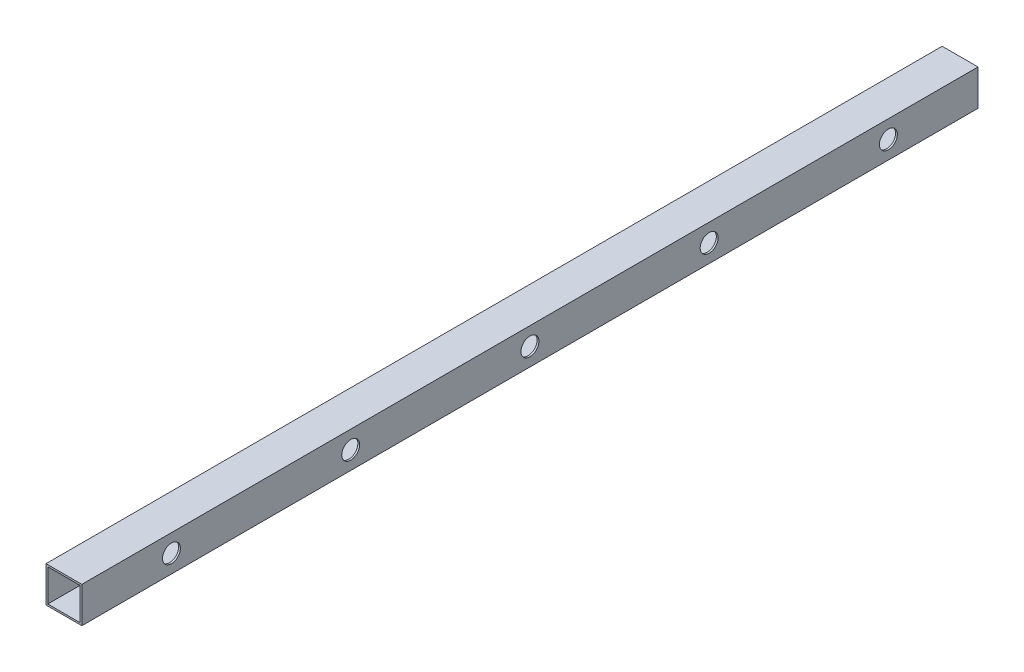
ISO-10303-21;
HEADER;
FILE_DESCRIPTION(('STEP AP214'),'2;1');
FILE_NAME('part.step','',(''),(''),'','','');
FILE_SCHEMA(('AUTOMOTIVE_DESIGN { 1 0 10303 214 1 1 1 1 }'));
ENDSEC;
DATA;
#1=APPLICATION_CONTEXT('core data for automotive mechanical design processes');
#2=APPLICATION_PROTOCOL_DEFINITION('international standard','automotive_design',2000,#1);
#3=PRODUCT_CONTEXT('',#1,'mechanical');
#4=PRODUCT('Part','Part','',(#3));
#5=PRODUCT_RELATED_PRODUCT_CATEGORY('part','',(#4));
#6=PRODUCT_DEFINITION_FORMATION('','',#4);
#7=PRODUCT_DEFINITION_CONTEXT('part definition',#1,'design');
#8=PRODUCT_DEFINITION('design','',#6,#7);
#9=PRODUCT_DEFINITION_SHAPE('','',#8);
#10=(LENGTH_UNIT() NAMED_UNIT(*) SI_UNIT(.MILLI.,.METRE.));
#11=(NAMED_UNIT(*) PLANE_ANGLE_UNIT() SI_UNIT($,.RADIAN.));
#12=(NAMED_UNIT(*) SI_UNIT($,.STERADIAN.) SOLID_ANGLE_UNIT());
#13=UNCERTAINTY_MEASURE_WITH_UNIT(LENGTH_MEASURE(1.E-05),#10,'distance_accuracy_value','');
#14=(GEOMETRIC_REPRESENTATION_CONTEXT(3) GLOBAL_UNCERTAINTY_ASSIGNED_CONTEXT((#13)) GLOBAL_UNIT_ASSIGNED_CONTEXT((#10,
#11,#12)) REPRESENTATION_CONTEXT('',''));
#15=CARTESIAN_POINT('',(0.,0.,0.));
#16=DIRECTION('',(0.,0.,1.));
#17=DIRECTION('',(1.,0.,0.));
#18=AXIS2_PLACEMENT_3D('',#15,#16,#17);
#19=CARTESIAN_POINT('',(-20.,-20.,1000.));
#20=DIRECTION('',(0.,0.,1.));
#21=DIRECTION('',(1.,0.,0.));
#22=AXIS2_PLACEMENT_3D('',#19,#20,#21);
#23=PLANE('',#22);
#24=DIRECTION('',(0.,-1.,0.));
#25=VECTOR('',#24,1.);
#26=CARTESIAN_POINT('',(-20.,-20.,1000.));
#27=LINE('',#26,#25);
#28=CARTESIAN_POINT('',(-20.,20.,1000.));
#29=VERTEX_POINT('',#28);
#30=CARTESIAN_POINT('',(-20.,-20.,1000.));
#31=VERTEX_POINT('',#30);
#32=EDGE_CURVE('E397',#29,#31,#27,.T.);
#33=ORIENTED_EDGE('',*,*,#32,.T.);
#34=DIRECTION('',(1.,0.,0.));
#35=VECTOR('',#34,1.);
#36=CARTESIAN_POINT('',(20.,-20.,1000.));
#37=LINE('',#36,#35);
#38=CARTESIAN_POINT('',(20.,-20.,1000.));
#39=VERTEX_POINT('',#38);
#40=EDGE_CURVE('E400',#31,#39,#37,.T.);
#41=ORIENTED_EDGE('',*,*,#40,.T.);
#42=DIRECTION('',(0.,1.,0.));
#43=VECTOR('',#42,1.);
#44=CARTESIAN_POINT('',(20.,-20.,1000.));
#45=LINE('',#44,#43);
#46=CARTESIAN_POINT('',(20.,20.,1000.));
#47=VERTEX_POINT('',#46);
#48=EDGE_CURVE('E403',#39,#47,#45,.T.);
#49=ORIENTED_EDGE('',*,*,#48,.T.);
#50=DIRECTION('',(-1.,0.,0.));
#51=VECTOR('',#50,1.);
#52=CARTESIAN_POINT('',(20.,20.,1000.));
#53=LINE('',#52,#51);
#54=EDGE_CURVE('E405',#47,#29,#53,.T.);
#55=ORIENTED_EDGE('',*,*,#54,.T.);
#56=EDGE_LOOP('',(#33,#41,#49,#55));
#57=FACE_BOUND('',#56,.T.);
#58=DIRECTION('',(1.,0.,0.));
#59=VECTOR('',#58,1.);
#60=CARTESIAN_POINT('',(20.,-18.,1000.));
#61=LINE('',#60,#59);
#62=CARTESIAN_POINT('',(-18.,-18.,1000.));
#63=VERTEX_POINT('',#62);
#64=CARTESIAN_POINT('',(18.,-18.,1000.));
#65=VERTEX_POINT('',#64);
#66=EDGE_CURVE('E367',#63,#65,#61,.T.);
#67=ORIENTED_EDGE('',*,*,#66,.F.);
#68=DIRECTION('',(0.,-1.,0.));
#69=VECTOR('',#68,1.);
#70=CARTESIAN_POINT('',(-18.,-20.,1000.));
#71=LINE('',#70,#69);
#72=CARTESIAN_POINT('',(-18.,18.,1000.));
#73=VERTEX_POINT('',#72);
#74=EDGE_CURVE('E365',#73,#63,#71,.T.);
#75=ORIENTED_EDGE('',*,*,#74,.F.);
#76=DIRECTION('',(-1.,0.,0.));
#77=VECTOR('',#76,1.);
#78=CARTESIAN_POINT('',(20.,18.,1000.));
#79=LINE('',#78,#77);
#80=CARTESIAN_POINT('',(18.,18.,1000.));
#81=VERTEX_POINT('',#80);
#82=EDGE_CURVE('E373',#81,#73,#79,.T.);
#83=ORIENTED_EDGE('',*,*,#82,.F.);
#84=DIRECTION('',(0.,1.,0.));
#85=VECTOR('',#84,1.);
#86=CARTESIAN_POINT('',(18.,-20.,1000.));
#87=LINE('',#86,#85);
#88=EDGE_CURVE('E370',#65,#81,#87,.T.);
#89=ORIENTED_EDGE('',*,*,#88,.F.);
#90=EDGE_LOOP('',(#67,#75,#83,#89));
#91=FACE_BOUND('',#90,.T.);
#92=ADVANCED_FACE('F54',(#57,#91),#23,.T.);
#93=CARTESIAN_POINT('',(-20.,-20.,0.));
#94=DIRECTION('',(0.,0.,1.));
#95=DIRECTION('',(1.,0.,0.));
#96=AXIS2_PLACEMENT_3D('',#93,#94,#95);
#97=PLANE('',#96);
#98=DIRECTION('',(0.,-1.,0.));
#99=VECTOR('',#98,1.);
#100=CARTESIAN_POINT('',(-20.,-20.,0.));
#101=LINE('',#100,#99);
#102=CARTESIAN_POINT('',(-20.,20.,0.));
#103=VERTEX_POINT('',#102);
#104=CARTESIAN_POINT('',(-20.,-20.,0.));
#105=VERTEX_POINT('',#104);
#106=EDGE_CURVE('E396',#103,#105,#101,.T.);
#107=ORIENTED_EDGE('',*,*,#106,.F.);
#108=DIRECTION('',(-1.,0.,0.));
#109=VECTOR('',#108,1.);
#110=CARTESIAN_POINT('',(20.,20.,0.));
#111=LINE('',#110,#109);
#112=CARTESIAN_POINT('',(20.,20.,0.));
#113=VERTEX_POINT('',#112);
#114=EDGE_CURVE('E401',#113,#103,#111,.T.);
#115=ORIENTED_EDGE('',*,*,#114,.F.);
#116=DIRECTION('',(0.,1.,0.));
#117=VECTOR('',#116,1.);
#118=CARTESIAN_POINT('',(20.,-20.,0.));
#119=LINE('',#118,#117);
#120=CARTESIAN_POINT('',(20.,-20.,0.));
#121=VERTEX_POINT('',#120);
#122=EDGE_CURVE('E412',#121,#113,#119,.T.);
#123=ORIENTED_EDGE('',*,*,#122,.F.);
#124=DIRECTION('',(1.,0.,0.));
#125=VECTOR('',#124,1.);
#126=CARTESIAN_POINT('',(20.,-20.,0.));
#127=LINE('',#126,#125);
#128=EDGE_CURVE('E410',#105,#121,#127,.T.);
#129=ORIENTED_EDGE('',*,*,#128,.F.);
#130=EDGE_LOOP('',(#107,#115,#123,#129));
#131=FACE_BOUND('',#130,.T.);
#132=DIRECTION('',(0.,-1.,0.));
#133=VECTOR('',#132,1.);
#134=CARTESIAN_POINT('',(-18.,-20.,0.));
#135=LINE('',#134,#133);
#136=CARTESIAN_POINT('',(-18.,18.,0.));
#137=VERTEX_POINT('',#136);
#138=CARTESIAN_POINT('',(-18.,-18.,0.));
#139=VERTEX_POINT('',#138);
#140=EDGE_CURVE('E376',#137,#139,#135,.T.);
#141=ORIENTED_EDGE('',*,*,#140,.T.);
#142=DIRECTION('',(1.,0.,0.));
#143=VECTOR('',#142,1.);
#144=CARTESIAN_POINT('',(20.,-18.,0.));
#145=LINE('',#144,#143);
#146=CARTESIAN_POINT('',(18.,-18.,0.));
#147=VERTEX_POINT('',#146);
#148=EDGE_CURVE('E379',#139,#147,#145,.T.);
#149=ORIENTED_EDGE('',*,*,#148,.T.);
#150=DIRECTION('',(0.,1.,0.));
#151=VECTOR('',#150,1.);
#152=CARTESIAN_POINT('',(18.,-20.,0.));
#153=LINE('',#152,#151);
#154=CARTESIAN_POINT('',(18.,18.,0.));
#155=VERTEX_POINT('',#154);
#156=EDGE_CURVE('E382',#147,#155,#153,.T.);
#157=ORIENTED_EDGE('',*,*,#156,.T.);
#158=DIRECTION('',(-1.,0.,0.));
#159=VECTOR('',#158,1.);
#160=CARTESIAN_POINT('',(20.,18.,0.));
#161=LINE('',#160,#159);
#162=EDGE_CURVE('E368',#155,#137,#161,.T.);
#163=ORIENTED_EDGE('',*,*,#162,.T.);
#164=EDGE_LOOP('',(#141,#149,#157,#163));
#165=FACE_BOUND('',#164,.T.);
#166=ADVANCED_FACE('F497',(#131,#165),#97,.F.);
#167=CARTESIAN_POINT('',(-20.,-20.,1000.));
#168=DIRECTION('',(1.,0.,0.));
#169=DIRECTION('',(0.,0.,-1.));
#170=AXIS2_PLACEMENT_3D('',#167,#168,#169);
#171=PLANE('',#170);
#172=DIRECTION('',(0.,0.,1.));
#173=VECTOR('',#172,1.);
#174=CARTESIAN_POINT('',(-20.,-15.0000000000138,930.));
#175=LINE('',#174,#173);
#176=CARTESIAN_POINT('',(-20.,-15.0000000000138,870.));
#177=VERTEX_POINT('',#176);
#178=CARTESIAN_POINT('',(-20.,-15.0000000000138,930.));
#179=VERTEX_POINT('',#178);
#180=EDGE_CURVE('E250',#177,#179,#175,.T.);
#181=ORIENTED_EDGE('',*,*,#180,.F.);
#182=DIRECTION('',(0.,-1.,0.));
#183=VECTOR('',#182,1.);
#184=CARTESIAN_POINT('',(-20.,-15.0000000000138,870.));
#185=LINE('',#184,#183);
#186=CARTESIAN_POINT('',(-20.,14.9999999999862,870.));
#187=VERTEX_POINT('',#186);
#188=EDGE_CURVE('E69',#187,#177,#185,.T.);
#189=ORIENTED_EDGE('',*,*,#188,.F.);
#190=DIRECTION('',(0.,0.,-1.));
#191=VECTOR('',#190,1.);
#192=CARTESIAN_POINT('',(-20.,14.9999999999862,930.));
#193=LINE('',#192,#191);
#194=CARTESIAN_POINT('',(-20.,14.9999999999862,930.));
#195=VERTEX_POINT('',#194);
#196=EDGE_CURVE('E256',#195,#187,#193,.T.);
#197=ORIENTED_EDGE('',*,*,#196,.F.);
#198=DIRECTION('',(0.,1.,0.));
#199=VECTOR('',#198,1.);
#200=CARTESIAN_POINT('',(-20.,-15.0000000000138,930.));
#201=LINE('',#200,#199);
#202=EDGE_CURVE('E241',#179,#195,#201,.T.);
#203=ORIENTED_EDGE('',*,*,#202,.F.);
#204=EDGE_LOOP('',(#181,#189,#197,#203));
#205=FACE_BOUND('',#204,.T.);
#206=DIRECTION('',(0.,0.,1.));
#207=VECTOR('',#206,1.);
#208=CARTESIAN_POINT('',(-20.,-15.0000000000138,730.));
#209=LINE('',#208,#207);
#210=CARTESIAN_POINT('',(-20.,-15.0000000000138,670.));
#211=VERTEX_POINT('',#210);
#212=CARTESIAN_POINT('',(-20.,-15.0000000000138,730.));
#213=VERTEX_POINT('',#212);
#214=EDGE_CURVE('E267',#211,#213,#209,.T.);
#215=ORIENTED_EDGE('',*,*,#214,.F.);
#216=DIRECTION('',(0.,-1.,0.));
#217=VECTOR('',#216,1.);
#218=CARTESIAN_POINT('',(-20.,-15.0000000000138,670.));
#219=LINE('',#218,#217);
#220=CARTESIAN_POINT('',(-20.,15.,670.));
#221=VERTEX_POINT('',#220);
#222=EDGE_CURVE('E263',#221,#211,#219,.T.);
#223=ORIENTED_EDGE('',*,*,#222,.F.);
#224=DIRECTION('',(0.,0.,-1.));
#225=VECTOR('',#224,1.);
#226=CARTESIAN_POINT('',(-20.,15.,730.));
#227=LINE('',#226,#225);
#228=CARTESIAN_POINT('',(-20.,15.,730.));
#229=VERTEX_POINT('',#228);
#230=EDGE_CURVE('E273',#229,#221,#227,.T.);
#231=ORIENTED_EDGE('',*,*,#230,.F.);
#232=DIRECTION('',(0.,1.,0.));
#233=VECTOR('',#232,1.);
#234=CARTESIAN_POINT('',(-20.,-15.0000000000138,730.));
#235=LINE('',#234,#233);
#236=EDGE_CURVE('E270',#213,#229,#235,.T.);
#237=ORIENTED_EDGE('',*,*,#236,.F.);
#238=EDGE_LOOP('',(#215,#223,#231,#237));
#239=FACE_BOUND('',#238,.T.);
#240=DIRECTION('',(0.,0.,1.));
#241=VECTOR('',#240,1.);
#242=CARTESIAN_POINT('',(-20.,-15.,530.));
#243=LINE('',#242,#241);
#244=CARTESIAN_POINT('',(-20.,-15.,470.));
#245=VERTEX_POINT('',#244);
#246=CARTESIAN_POINT('',(-20.,-15.,530.));
#247=VERTEX_POINT('',#246);
#248=EDGE_CURVE('E287',#245,#247,#243,.T.);
#249=ORIENTED_EDGE('',*,*,#248,.F.);
#250=DIRECTION('',(0.,-1.,0.));
#251=VECTOR('',#250,1.);
#252=CARTESIAN_POINT('',(-20.,-15.,470.));
#253=LINE('',#252,#251);
#254=CARTESIAN_POINT('',(-20.,15.,470.));
#255=VERTEX_POINT('',#254);
#256=EDGE_CURVE('E279',#255,#245,#253,.T.);
#257=ORIENTED_EDGE('',*,*,#256,.F.);
#258=DIRECTION('',(0.,0.,-1.));
#259=VECTOR('',#258,1.);
#260=CARTESIAN_POINT('',(-20.,15.,530.));
#261=LINE('',#260,#259);
#262=CARTESIAN_POINT('',(-20.,15.,530.));
#263=VERTEX_POINT('',#262);
#264=EDGE_CURVE('E293',#263,#255,#261,.T.);
#265=ORIENTED_EDGE('',*,*,#264,.F.);
#266=DIRECTION('',(0.,1.,0.));
#267=VECTOR('',#266,1.);
#268=CARTESIAN_POINT('',(-20.,-15.,530.));
#269=LINE('',#268,#267);
#270=EDGE_CURVE('E290',#247,#263,#269,.T.);
#271=ORIENTED_EDGE('',*,*,#270,.F.);
#272=EDGE_LOOP('',(#249,#257,#265,#271));
#273=FACE_BOUND('',#272,.T.);
#274=DIRECTION('',(0.,0.,1.));
#275=VECTOR('',#274,1.);
#276=CARTESIAN_POINT('',(-20.,-15.,330.));
#277=LINE('',#276,#275);
#278=CARTESIAN_POINT('',(-20.,-15.,270.));
#279=VERTEX_POINT('',#278);
#280=CARTESIAN_POINT('',(-20.,-15.,330.));
#281=VERTEX_POINT('',#280);
#282=EDGE_CURVE('E307',#279,#281,#277,.T.);
#283=ORIENTED_EDGE('',*,*,#282,.F.);
#284=DIRECTION('',(0.,-1.,0.));
#285=VECTOR('',#284,1.);
#286=CARTESIAN_POINT('',(-20.,-15.,270.));
#287=LINE('',#286,#285);
#288=CARTESIAN_POINT('',(-20.,15.,270.));
#289=VERTEX_POINT('',#288);
#290=EDGE_CURVE('E299',#289,#279,#287,.T.);
#291=ORIENTED_EDGE('',*,*,#290,.F.);
#292=DIRECTION('',(0.,0.,-1.));
#293=VECTOR('',#292,1.);
#294=CARTESIAN_POINT('',(-20.,15.,330.));
#295=LINE('',#294,#293);
#296=CARTESIAN_POINT('',(-20.,15.,330.));
#297=VERTEX_POINT('',#296);
#298=EDGE_CURVE('E313',#297,#289,#295,.T.);
#299=ORIENTED_EDGE('',*,*,#298,.F.);
#300=DIRECTION('',(0.,1.,0.));
#301=VECTOR('',#300,1.);
#302=CARTESIAN_POINT('',(-20.,-15.,330.));
#303=LINE('',#302,#301);
#304=EDGE_CURVE('E310',#281,#297,#303,.T.);
#305=ORIENTED_EDGE('',*,*,#304,.F.);
#306=EDGE_LOOP('',(#283,#291,#299,#305));
#307=FACE_BOUND('',#306,.T.);
#308=DIRECTION('',(0.,0.,1.));
#309=VECTOR('',#308,1.);
#310=CARTESIAN_POINT('',(-20.,-15.,130.));
#311=LINE('',#310,#309);
#312=CARTESIAN_POINT('',(-20.,-15.,70.0000000000001));
#313=VERTEX_POINT('',#312);
#314=CARTESIAN_POINT('',(-20.,-15.,130.));
#315=VERTEX_POINT('',#314);
#316=EDGE_CURVE('E327',#313,#315,#311,.T.);
#317=ORIENTED_EDGE('',*,*,#316,.F.);
#318=DIRECTION('',(0.,-1.,0.));
#319=VECTOR('',#318,1.);
#320=CARTESIAN_POINT('',(-20.,-15.,70.));
#321=LINE('',#320,#319);
#322=CARTESIAN_POINT('',(-20.,15.,70.));
#323=VERTEX_POINT('',#322);
#324=EDGE_CURVE('E319',#323,#313,#321,.T.);
#325=ORIENTED_EDGE('',*,*,#324,.F.);
#326=DIRECTION('',(0.,0.,-1.));
#327=VECTOR('',#326,1.);
#328=CARTESIAN_POINT('',(-20.,15.,130.));
#329=LINE('',#328,#327);
#330=CARTESIAN_POINT('',(-20.,15.,130.));
#331=VERTEX_POINT('',#330);
#332=EDGE_CURVE('E333',#331,#323,#329,.T.);
#333=ORIENTED_EDGE('',*,*,#332,.F.);
#334=DIRECTION('',(0.,1.,0.));
#335=VECTOR('',#334,1.);
#336=CARTESIAN_POINT('',(-20.,-15.,130.));
#337=LINE('',#336,#335);
#338=EDGE_CURVE('E330',#315,#331,#337,.T.);
#339=ORIENTED_EDGE('',*,*,#338,.F.);
#340=EDGE_LOOP('',(#317,#325,#333,#339));
#341=FACE_BOUND('',#340,.T.);
#342=ORIENTED_EDGE('',*,*,#106,.T.);
#343=DIRECTION('',(0.,0.,-1.));
#344=VECTOR('',#343,1.);
#345=CARTESIAN_POINT('',(-20.,-20.,1000.));
#346=LINE('',#345,#344);
#347=EDGE_CURVE('E423',#31,#105,#346,.T.);
#348=ORIENTED_EDGE('',*,*,#347,.F.);
#349=ORIENTED_EDGE('',*,*,#32,.F.);
#350=DIRECTION('',(0.,0.,-1.));
#351=VECTOR('',#350,1.);
#352=CARTESIAN_POINT('',(-20.,20.,1000.));
#353=LINE('',#352,#351);
#354=EDGE_CURVE('E407',#29,#103,#353,.T.);
#355=ORIENTED_EDGE('',*,*,#354,.T.);
#356=EDGE_LOOP('',(#342,#348,#349,#355));
#357=FACE_BOUND('',#356,.T.);
#358=ADVANCED_FACE('F56',(#205,#239,#273,#307,#341,#357),#171,.F.);
#359=CARTESIAN_POINT('',(20.,-20.,1000.));
#360=DIRECTION('',(0.,1.,0.));
#361=DIRECTION('',(-1.,0.,0.));
#362=AXIS2_PLACEMENT_3D('',#359,#360,#361);
#363=PLANE('',#362);
#364=ORIENTED_EDGE('',*,*,#128,.T.);
#365=DIRECTION('',(0.,0.,-1.));
#366=VECTOR('',#365,1.);
#367=CARTESIAN_POINT('',(20.,-20.,1000.));
#368=LINE('',#367,#366);
#369=EDGE_CURVE('E420',#39,#121,#368,.T.);
#370=ORIENTED_EDGE('',*,*,#369,.F.);
#371=ORIENTED_EDGE('',*,*,#40,.F.);
#372=ORIENTED_EDGE('',*,*,#347,.T.);
#373=EDGE_LOOP('',(#364,#370,#371,#372));
#374=FACE_BOUND('',#373,.T.);
#375=ADVANCED_FACE('F515',(#374),#363,.F.);
#376=CARTESIAN_POINT('',(20.,-20.,1000.));
#377=DIRECTION('',(-1.,0.,0.));
#378=DIRECTION('',(0.,0.,1.));
#379=AXIS2_PLACEMENT_3D('',#376,#377,#378);
#380=PLANE('',#379);
#381=CARTESIAN_POINT('',(20.,-1.38048643696931E-11,900.));
#382=DIRECTION('',(1.,0.,0.));
#383=DIRECTION('',(0.,0.,-1.));
#384=AXIS2_PLACEMENT_3D('',#381,#382,#383);
#385=CIRCLE('',#384,9.99999999999998);
#386=CARTESIAN_POINT('',(20.,-1.38048643696931E-11,890.));
#387=VERTEX_POINT('',#386);
#388=EDGE_CURVE('E339',#387,#387,#385,.T.);
#389=ORIENTED_EDGE('',*,*,#388,.F.);
#390=EDGE_LOOP('',(#389));
#391=FACE_BOUND('',#390,.T.);
#392=CARTESIAN_POINT('',(20.,-6.90156482310855E-12,700.));
#393=DIRECTION('',(1.,0.,0.));
#394=DIRECTION('',(0.,0.,-1.));
#395=AXIS2_PLACEMENT_3D('',#392,#393,#394);
#396=CIRCLE('',#395,9.99999999999988);
#397=CARTESIAN_POINT('',(20.,-6.90156482310855E-12,690.));
#398=VERTEX_POINT('',#397);
#399=EDGE_CURVE('E349',#398,#398,#396,.T.);
#400=ORIENTED_EDGE('',*,*,#399,.F.);
#401=EDGE_LOOP('',(#400));
#402=FACE_BOUND('',#401,.T.);
#403=CARTESIAN_POINT('',(20.,0.,100.));
#404=DIRECTION('',(1.,0.,0.));
#405=DIRECTION('',(0.,0.,-1.));
#406=AXIS2_PLACEMENT_3D('',#403,#404,#405);
#407=CIRCLE('',#406,9.99999999999998);
#408=CARTESIAN_POINT('',(20.,0.,90.));
#409=VERTEX_POINT('',#408);
#410=EDGE_CURVE('E353',#409,#409,#407,.T.);
#411=ORIENTED_EDGE('',*,*,#410,.F.);
#412=EDGE_LOOP('',(#411));
#413=FACE_BOUND('',#412,.T.);
#414=CARTESIAN_POINT('',(20.,0.,300.));
#415=DIRECTION('',(1.,0.,0.));
#416=DIRECTION('',(0.,0.,-1.));
#417=AXIS2_PLACEMENT_3D('',#414,#415,#416);
#418=CIRCLE('',#417,9.99999999999998);
#419=CARTESIAN_POINT('',(20.,0.,290.));
#420=VERTEX_POINT('',#419);
#421=EDGE_CURVE('E357',#420,#420,#418,.T.);
#422=ORIENTED_EDGE('',*,*,#421,.F.);
#423=EDGE_LOOP('',(#422));
#424=FACE_BOUND('',#423,.T.);
#425=CARTESIAN_POINT('',(20.,0.,500.));
#426=DIRECTION('',(1.,0.,0.));
#427=DIRECTION('',(0.,0.,-1.));
#428=AXIS2_PLACEMENT_3D('',#425,#426,#427);
#429=CIRCLE('',#428,9.99999999999998);
#430=CARTESIAN_POINT('',(20.,0.,490.));
#431=VERTEX_POINT('',#430);
#432=EDGE_CURVE('E361',#431,#431,#429,.T.);
#433=ORIENTED_EDGE('',*,*,#432,.F.);
#434=EDGE_LOOP('',(#433));
#435=FACE_BOUND('',#434,.T.);
#436=ORIENTED_EDGE('',*,*,#122,.T.);
#437=DIRECTION('',(0.,0.,-1.));
#438=VECTOR('',#437,1.);
#439=CARTESIAN_POINT('',(20.,20.,1000.));
#440=LINE('',#439,#438);
#441=EDGE_CURVE('E417',#47,#113,#440,.T.);
#442=ORIENTED_EDGE('',*,*,#441,.F.);
#443=ORIENTED_EDGE('',*,*,#48,.F.);
#444=ORIENTED_EDGE('',*,*,#369,.T.);
#445=EDGE_LOOP('',(#436,#442,#443,#444));
#446=FACE_BOUND('',#445,.T.);
#447=ADVANCED_FACE('F512',(#391,#402,#413,#424,#435,#446),#380,.F.);
#448=CARTESIAN_POINT('',(20.,20.,1000.));
#449=DIRECTION('',(0.,-1.,0.));
#450=DIRECTION('',(1.,0.,0.));
#451=AXIS2_PLACEMENT_3D('',#448,#449,#450);
#452=PLANE('',#451);
#453=ORIENTED_EDGE('',*,*,#114,.T.);
#454=ORIENTED_EDGE('',*,*,#354,.F.);
#455=ORIENTED_EDGE('',*,*,#54,.F.);
#456=ORIENTED_EDGE('',*,*,#441,.T.);
#457=EDGE_LOOP('',(#453,#454,#455,#456));
#458=FACE_BOUND('',#457,.T.);
#459=ADVANCED_FACE('F509',(#458),#452,.F.);
#460=CARTESIAN_POINT('',(-18.,-20.,1000.));
#461=DIRECTION('',(1.,0.,0.));
#462=DIRECTION('',(0.,0.,-1.));
#463=AXIS2_PLACEMENT_3D('',#460,#461,#462);
#464=PLANE('',#463);
#465=DIRECTION('',(0.,1.,0.));
#466=VECTOR('',#465,1.);
#467=CARTESIAN_POINT('',(-18.,-20.,870.));
#468=LINE('',#467,#466);
#469=CARTESIAN_POINT('',(-18.,-15.0000000000138,870.));
#470=VERTEX_POINT('',#469);
#471=CARTESIAN_POINT('',(-18.,14.9999999999862,870.));
#472=VERTEX_POINT('',#471);
#473=EDGE_CURVE('E12',#470,#472,#468,.T.);
#474=ORIENTED_EDGE('',*,*,#473,.F.);
#475=DIRECTION('',(0.,0.,-1.));
#476=VECTOR('',#475,1.);
#477=CARTESIAN_POINT('',(-18.,-15.0000000000138,1000.));
#478=LINE('',#477,#476);
#479=CARTESIAN_POINT('',(-18.,-15.0000000000138,930.));
#480=VERTEX_POINT('',#479);
#481=EDGE_CURVE('E472',#480,#470,#478,.T.);
#482=ORIENTED_EDGE('',*,*,#481,.F.);
#483=DIRECTION('',(0.,-1.,0.));
#484=VECTOR('',#483,1.);
#485=CARTESIAN_POINT('',(-18.,-20.,930.));
#486=LINE('',#485,#484);
#487=CARTESIAN_POINT('',(-18.,14.9999999999862,930.));
#488=VERTEX_POINT('',#487);
#489=EDGE_CURVE('E244',#488,#480,#486,.T.);
#490=ORIENTED_EDGE('',*,*,#489,.F.);
#491=DIRECTION('',(0.,0.,1.));
#492=VECTOR('',#491,1.);
#493=CARTESIAN_POINT('',(-18.,14.9999999999862,1000.));
#494=LINE('',#493,#492);
#495=EDGE_CURVE('E62',#472,#488,#494,.T.);
#496=ORIENTED_EDGE('',*,*,#495,.F.);
#497=EDGE_LOOP('',(#474,#482,#490,#496));
#498=FACE_BOUND('',#497,.T.);
#499=DIRECTION('',(0.,1.,0.));
#500=VECTOR('',#499,1.);
#501=CARTESIAN_POINT('',(-18.,-20.,670.));
#502=LINE('',#501,#500);
#503=CARTESIAN_POINT('',(-18.,-15.0000000000138,670.));
#504=VERTEX_POINT('',#503);
#505=CARTESIAN_POINT('',(-18.,15.,670.));
#506=VERTEX_POINT('',#505);
#507=EDGE_CURVE('E470',#504,#506,#502,.T.);
#508=ORIENTED_EDGE('',*,*,#507,.F.);
#509=DIRECTION('',(0.,0.,-1.));
#510=VECTOR('',#509,1.);
#511=CARTESIAN_POINT('',(-18.,-15.0000000000138,1000.));
#512=LINE('',#511,#510);
#513=CARTESIAN_POINT('',(-18.,-15.0000000000138,730.));
#514=VERTEX_POINT('',#513);
#515=EDGE_CURVE('E463',#514,#504,#512,.T.);
#516=ORIENTED_EDGE('',*,*,#515,.F.);
#517=DIRECTION('',(0.,-1.,0.));
#518=VECTOR('',#517,1.);
#519=CARTESIAN_POINT('',(-18.,-20.,730.));
#520=LINE('',#519,#518);
#521=CARTESIAN_POINT('',(-18.,15.,730.));
#522=VERTEX_POINT('',#521);
#523=EDGE_CURVE('E465',#522,#514,#520,.T.);
#524=ORIENTED_EDGE('',*,*,#523,.F.);
#525=DIRECTION('',(0.,0.,1.));
#526=VECTOR('',#525,1.);
#527=CARTESIAN_POINT('',(-18.,15.,1000.));
#528=LINE('',#527,#526);
#529=EDGE_CURVE('E468',#506,#522,#528,.T.);
#530=ORIENTED_EDGE('',*,*,#529,.F.);
#531=EDGE_LOOP('',(#508,#516,#524,#530));
#532=FACE_BOUND('',#531,.T.);
#533=DIRECTION('',(0.,1.,0.));
#534=VECTOR('',#533,1.);
#535=CARTESIAN_POINT('',(-18.,-20.,470.));
#536=LINE('',#535,#534);
#537=CARTESIAN_POINT('',(-18.,-15.,470.));
#538=VERTEX_POINT('',#537);
#539=CARTESIAN_POINT('',(-18.,15.,470.));
#540=VERTEX_POINT('',#539);
#541=EDGE_CURVE('E461',#538,#540,#536,.T.);
#542=ORIENTED_EDGE('',*,*,#541,.F.);
#543=DIRECTION('',(0.,0.,-1.));
#544=VECTOR('',#543,1.);
#545=CARTESIAN_POINT('',(-18.,-15.,1000.));
#546=LINE('',#545,#544);
#547=CARTESIAN_POINT('',(-18.,-15.,530.));
#548=VERTEX_POINT('',#547);
#549=EDGE_CURVE('E454',#548,#538,#546,.T.);
#550=ORIENTED_EDGE('',*,*,#549,.F.);
#551=DIRECTION('',(0.,-1.,0.));
#552=VECTOR('',#551,1.);
#553=CARTESIAN_POINT('',(-18.,-20.,530.));
#554=LINE('',#553,#552);
#555=CARTESIAN_POINT('',(-18.,15.,530.));
#556=VERTEX_POINT('',#555);
#557=EDGE_CURVE('E456',#556,#548,#554,.T.);
#558=ORIENTED_EDGE('',*,*,#557,.F.);
#559=DIRECTION('',(0.,0.,1.));
#560=VECTOR('',#559,1.);
#561=CARTESIAN_POINT('',(-18.,15.0000000000001,1000.));
#562=LINE('',#561,#560);
#563=EDGE_CURVE('E459',#540,#556,#562,.T.);
#564=ORIENTED_EDGE('',*,*,#563,.F.);
#565=EDGE_LOOP('',(#542,#550,#558,#564));
#566=FACE_BOUND('',#565,.T.);
#567=DIRECTION('',(0.,1.,0.));
#568=VECTOR('',#567,1.);
#569=CARTESIAN_POINT('',(-18.,-20.,270.));
#570=LINE('',#569,#568);
#571=CARTESIAN_POINT('',(-18.,-15.,270.));
#572=VERTEX_POINT('',#571);
#573=CARTESIAN_POINT('',(-18.,15.,270.));
#574=VERTEX_POINT('',#573);
#575=EDGE_CURVE('E452',#572,#574,#570,.T.);
#576=ORIENTED_EDGE('',*,*,#575,.F.);
#577=DIRECTION('',(0.,0.,-1.));
#578=VECTOR('',#577,1.);
#579=CARTESIAN_POINT('',(-18.,-15.,1000.));
#580=LINE('',#579,#578);
#581=CARTESIAN_POINT('',(-18.,-15.,330.));
#582=VERTEX_POINT('',#581);
#583=EDGE_CURVE('E445',#582,#572,#580,.T.);
#584=ORIENTED_EDGE('',*,*,#583,.F.);
#585=DIRECTION('',(0.,-1.,0.));
#586=VECTOR('',#585,1.);
#587=CARTESIAN_POINT('',(-18.,-20.,330.));
#588=LINE('',#587,#586);
#589=CARTESIAN_POINT('',(-18.,15.,330.));
#590=VERTEX_POINT('',#589);
#591=EDGE_CURVE('E447',#590,#582,#588,.T.);
#592=ORIENTED_EDGE('',*,*,#591,.F.);
#593=DIRECTION('',(0.,0.,1.));
#594=VECTOR('',#593,1.);
#595=CARTESIAN_POINT('',(-18.,15.0000000000001,1000.));
#596=LINE('',#595,#594);
#597=EDGE_CURVE('E450',#574,#590,#596,.T.);
#598=ORIENTED_EDGE('',*,*,#597,.F.);
#599=EDGE_LOOP('',(#576,#584,#592,#598));
#600=FACE_BOUND('',#599,.T.);
#601=DIRECTION('',(0.,1.,0.));
#602=VECTOR('',#601,1.);
#603=CARTESIAN_POINT('',(-18.,-20.,70.));
#604=LINE('',#603,#602);
#605=CARTESIAN_POINT('',(-18.,-15.,70.));
#606=VERTEX_POINT('',#605);
#607=CARTESIAN_POINT('',(-18.,15.,70.));
#608=VERTEX_POINT('',#607);
#609=EDGE_CURVE('E443',#606,#608,#604,.T.);
#610=ORIENTED_EDGE('',*,*,#609,.F.);
#611=DIRECTION('',(0.,0.,-1.));
#612=VECTOR('',#611,1.);
#613=CARTESIAN_POINT('',(-18.,-15.,1000.));
#614=LINE('',#613,#612);
#615=CARTESIAN_POINT('',(-18.,-15.,130.));
#616=VERTEX_POINT('',#615);
#617=EDGE_CURVE('E426',#616,#606,#614,.T.);
#618=ORIENTED_EDGE('',*,*,#617,.F.);
#619=DIRECTION('',(0.,-1.,0.));
#620=VECTOR('',#619,1.);
#621=CARTESIAN_POINT('',(-18.,-20.,130.));
#622=LINE('',#621,#620);
#623=CARTESIAN_POINT('',(-18.,15.,130.));
#624=VERTEX_POINT('',#623);
#625=EDGE_CURVE('E438',#624,#616,#622,.T.);
#626=ORIENTED_EDGE('',*,*,#625,.F.);
#627=DIRECTION('',(0.,0.,1.));
#628=VECTOR('',#627,1.);
#629=CARTESIAN_POINT('',(-18.,15.0000000000001,1000.));
#630=LINE('',#629,#628);
#631=EDGE_CURVE('E441',#608,#624,#630,.T.);
#632=ORIENTED_EDGE('',*,*,#631,.F.);
#633=EDGE_LOOP('',(#610,#618,#626,#632));
#634=FACE_BOUND('',#633,.T.);
#635=ORIENTED_EDGE('',*,*,#140,.F.);
#636=DIRECTION('',(0.,0.,-1.));
#637=VECTOR('',#636,1.);
#638=CARTESIAN_POINT('',(-18.,18.,1000.));
#639=LINE('',#638,#637);
#640=EDGE_CURVE('E375',#73,#137,#639,.T.);
#641=ORIENTED_EDGE('',*,*,#640,.F.);
#642=ORIENTED_EDGE('',*,*,#74,.T.);
#643=DIRECTION('',(0.,0.,-1.));
#644=VECTOR('',#643,1.);
#645=CARTESIAN_POINT('',(-18.,-18.,1000.));
#646=LINE('',#645,#644);
#647=EDGE_CURVE('E393',#63,#139,#646,.T.);
#648=ORIENTED_EDGE('',*,*,#647,.T.);
#649=EDGE_LOOP('',(#635,#641,#642,#648));
#650=FACE_BOUND('',#649,.T.);
#651=ADVANCED_FACE('F480',(#498,#532,#566,#600,#634,#650),#464,.T.);
#652=CARTESIAN_POINT('',(20.,-18.,1000.));
#653=DIRECTION('',(0.,1.,0.));
#654=DIRECTION('',(-1.,0.,0.));
#655=AXIS2_PLACEMENT_3D('',#652,#653,#654);
#656=PLANE('',#655);
#657=ORIENTED_EDGE('',*,*,#148,.F.);
#658=ORIENTED_EDGE('',*,*,#647,.F.);
#659=ORIENTED_EDGE('',*,*,#66,.T.);
#660=DIRECTION('',(0.,0.,-1.));
#661=VECTOR('',#660,1.);
#662=CARTESIAN_POINT('',(18.,-18.,1000.));
#663=LINE('',#662,#661);
#664=EDGE_CURVE('E391',#65,#147,#663,.T.);
#665=ORIENTED_EDGE('',*,*,#664,.T.);
#666=EDGE_LOOP('',(#657,#658,#659,#665));
#667=FACE_BOUND('',#666,.T.);
#668=ADVANCED_FACE('F548',(#667),#656,.T.);
#669=CARTESIAN_POINT('',(18.,-20.,1000.));
#670=DIRECTION('',(-1.,0.,0.));
#671=DIRECTION('',(0.,0.,1.));
#672=AXIS2_PLACEMENT_3D('',#669,#670,#671);
#673=PLANE('',#672);
#674=CARTESIAN_POINT('',(18.,-1.38048643696931E-11,900.));
#675=DIRECTION('',(-1.,0.,0.));
#676=DIRECTION('',(0.,0.,1.));
#677=AXIS2_PLACEMENT_3D('',#674,#675,#676);
#678=CIRCLE('',#677,9.99999999999998);
#679=CARTESIAN_POINT('',(18.,-1.38048643696931E-11,910.));
#680=VERTEX_POINT('',#679);
#681=EDGE_CURVE('E348',#680,#680,#678,.T.);
#682=ORIENTED_EDGE('',*,*,#681,.F.);
#683=EDGE_LOOP('',(#682));
#684=FACE_BOUND('',#683,.T.);
#685=CARTESIAN_POINT('',(18.,-6.90156482310855E-12,700.));
#686=DIRECTION('',(-1.,0.,0.));
#687=DIRECTION('',(0.,0.,1.));
#688=AXIS2_PLACEMENT_3D('',#685,#686,#687);
#689=CIRCLE('',#688,9.99999999999988);
#690=CARTESIAN_POINT('',(18.,-6.90156482310855E-12,710.));
#691=VERTEX_POINT('',#690);
#692=EDGE_CURVE('E352',#691,#691,#689,.T.);
#693=ORIENTED_EDGE('',*,*,#692,.F.);
#694=EDGE_LOOP('',(#693));
#695=FACE_BOUND('',#694,.T.);
#696=CARTESIAN_POINT('',(18.,0.,100.));
#697=DIRECTION('',(-1.,0.,0.));
#698=DIRECTION('',(0.,0.,1.));
#699=AXIS2_PLACEMENT_3D('',#696,#697,#698);
#700=CIRCLE('',#699,9.99999999999998);
#701=CARTESIAN_POINT('',(18.,0.,110.));
#702=VERTEX_POINT('',#701);
#703=EDGE_CURVE('E356',#702,#702,#700,.T.);
#704=ORIENTED_EDGE('',*,*,#703,.F.);
#705=EDGE_LOOP('',(#704));
#706=FACE_BOUND('',#705,.T.);
#707=CARTESIAN_POINT('',(18.,0.,300.));
#708=DIRECTION('',(-1.,0.,0.));
#709=DIRECTION('',(0.,0.,1.));
#710=AXIS2_PLACEMENT_3D('',#707,#708,#709);
#711=CIRCLE('',#710,9.99999999999998);
#712=CARTESIAN_POINT('',(18.,0.,310.));
#713=VERTEX_POINT('',#712);
#714=EDGE_CURVE('E360',#713,#713,#711,.T.);
#715=ORIENTED_EDGE('',*,*,#714,.F.);
#716=EDGE_LOOP('',(#715));
#717=FACE_BOUND('',#716,.T.);
#718=CARTESIAN_POINT('',(18.,0.,500.));
#719=DIRECTION('',(-1.,0.,0.));
#720=DIRECTION('',(0.,0.,1.));
#721=AXIS2_PLACEMENT_3D('',#718,#719,#720);
#722=CIRCLE('',#721,9.99999999999998);
#723=CARTESIAN_POINT('',(18.,0.,510.));
#724=VERTEX_POINT('',#723);
#725=EDGE_CURVE('E364',#724,#724,#722,.T.);
#726=ORIENTED_EDGE('',*,*,#725,.F.);
#727=EDGE_LOOP('',(#726));
#728=FACE_BOUND('',#727,.T.);
#729=ORIENTED_EDGE('',*,*,#156,.F.);
#730=ORIENTED_EDGE('',*,*,#664,.F.);
#731=ORIENTED_EDGE('',*,*,#88,.T.);
#732=DIRECTION('',(0.,0.,-1.));
#733=VECTOR('',#732,1.);
#734=CARTESIAN_POINT('',(18.,18.,1000.));
#735=LINE('',#734,#733);
#736=EDGE_CURVE('E389',#81,#155,#735,.T.);
#737=ORIENTED_EDGE('',*,*,#736,.T.);
#738=EDGE_LOOP('',(#729,#730,#731,#737));
#739=FACE_BOUND('',#738,.T.);
#740=ADVANCED_FACE('F552',(#684,#695,#706,#717,#728,#739),#673,.T.);
#741=CARTESIAN_POINT('',(20.,18.,1000.));
#742=DIRECTION('',(0.,-1.,0.));
#743=DIRECTION('',(1.,0.,0.));
#744=AXIS2_PLACEMENT_3D('',#741,#742,#743);
#745=PLANE('',#744);
#746=ORIENTED_EDGE('',*,*,#162,.F.);
#747=ORIENTED_EDGE('',*,*,#736,.F.);
#748=ORIENTED_EDGE('',*,*,#82,.T.);
#749=ORIENTED_EDGE('',*,*,#640,.T.);
#750=EDGE_LOOP('',(#746,#747,#748,#749));
#751=FACE_BOUND('',#750,.T.);
#752=ADVANCED_FACE('F543',(#751),#745,.T.);
#753=CARTESIAN_POINT('',(10.,0.,500.));
#754=DIRECTION('',(1.,0.,0.));
#755=DIRECTION('',(0.,0.,-1.));
#756=AXIS2_PLACEMENT_3D('',#753,#754,#755);
#757=CYLINDRICAL_SURFACE('',#756,9.99999999999998);
#758=ORIENTED_EDGE('',*,*,#725,.T.);
#759=EDGE_LOOP('',(#758));
#760=FACE_BOUND('',#759,.T.);
#761=ORIENTED_EDGE('',*,*,#432,.T.);
#762=EDGE_LOOP('',(#761));
#763=FACE_BOUND('',#762,.T.);
#764=ADVANCED_FACE('F560',(#760,#763),#757,.F.);
#765=CARTESIAN_POINT('',(10.,0.,300.));
#766=DIRECTION('',(1.,0.,0.));
#767=DIRECTION('',(0.,0.,-1.));
#768=AXIS2_PLACEMENT_3D('',#765,#766,#767);
#769=CYLINDRICAL_SURFACE('',#768,9.99999999999998);
#770=ORIENTED_EDGE('',*,*,#714,.T.);
#771=EDGE_LOOP('',(#770));
#772=FACE_BOUND('',#771,.T.);
#773=ORIENTED_EDGE('',*,*,#421,.T.);
#774=EDGE_LOOP('',(#773));
#775=FACE_BOUND('',#774,.T.);
#776=ADVANCED_FACE('F568',(#772,#775),#769,.F.);
#777=CARTESIAN_POINT('',(10.,0.,100.));
#778=DIRECTION('',(1.,0.,0.));
#779=DIRECTION('',(0.,0.,-1.));
#780=AXIS2_PLACEMENT_3D('',#777,#778,#779);
#781=CYLINDRICAL_SURFACE('',#780,9.99999999999998);
#782=ORIENTED_EDGE('',*,*,#703,.T.);
#783=EDGE_LOOP('',(#782));
#784=FACE_BOUND('',#783,.T.);
#785=ORIENTED_EDGE('',*,*,#410,.T.);
#786=EDGE_LOOP('',(#785));
#787=FACE_BOUND('',#786,.T.);
#788=ADVANCED_FACE('F572',(#784,#787),#781,.F.);
#789=CARTESIAN_POINT('',(10.,-6.90156482310855E-12,700.));
#790=DIRECTION('',(1.,0.,0.));
#791=DIRECTION('',(0.,0.,-1.));
#792=AXIS2_PLACEMENT_3D('',#789,#790,#791);
#793=CYLINDRICAL_SURFACE('',#792,9.99999999999988);
#794=ORIENTED_EDGE('',*,*,#692,.T.);
#795=EDGE_LOOP('',(#794));
#796=FACE_BOUND('',#795,.T.);
#797=ORIENTED_EDGE('',*,*,#399,.T.);
#798=EDGE_LOOP('',(#797));
#799=FACE_BOUND('',#798,.T.);
#800=ADVANCED_FACE('F576',(#796,#799),#793,.F.);
#801=CARTESIAN_POINT('',(10.,-1.38048643696931E-11,900.));
#802=DIRECTION('',(1.,0.,0.));
#803=DIRECTION('',(0.,0.,-1.));
#804=AXIS2_PLACEMENT_3D('',#801,#802,#803);
#805=CYLINDRICAL_SURFACE('',#804,9.99999999999998);
#806=ORIENTED_EDGE('',*,*,#681,.T.);
#807=EDGE_LOOP('',(#806));
#808=FACE_BOUND('',#807,.T.);
#809=ORIENTED_EDGE('',*,*,#388,.T.);
#810=EDGE_LOOP('',(#809));
#811=FACE_BOUND('',#810,.T.);
#812=ADVANCED_FACE('F580',(#808,#811),#805,.F.);
#813=CARTESIAN_POINT('',(-10.,-15.,70.));
#814=DIRECTION('',(0.,0.,-1.));
#815=DIRECTION('',(-1.,0.,0.));
#816=AXIS2_PLACEMENT_3D('',#813,#814,#815);
#817=PLANE('',#816);
#818=ORIENTED_EDGE('',*,*,#609,.T.);
#819=DIRECTION('',(-1.,0.,0.));
#820=VECTOR('',#819,1.);
#821=CARTESIAN_POINT('',(-10.,15.,70.));
#822=LINE('',#821,#820);
#823=EDGE_CURVE('E337',#608,#323,#822,.T.);
#824=ORIENTED_EDGE('',*,*,#823,.T.);
#825=ORIENTED_EDGE('',*,*,#324,.T.);
#826=DIRECTION('',(-1.,0.,0.));
#827=VECTOR('',#826,1.);
#828=CARTESIAN_POINT('',(-10.,-15.,70.));
#829=LINE('',#828,#827);
#830=EDGE_CURVE('E336',#606,#313,#829,.T.);
#831=ORIENTED_EDGE('',*,*,#830,.F.);
#832=EDGE_LOOP('',(#818,#824,#825,#831));
#833=FACE_BOUND('',#832,.T.);
#834=ADVANCED_FACE('F584',(#833),#817,.F.);
#835=CARTESIAN_POINT('',(-10.,15.,130.));
#836=DIRECTION('',(0.,1.,0.));
#837=DIRECTION('',(0.,0.,1.));
#838=AXIS2_PLACEMENT_3D('',#835,#836,#837);
#839=PLANE('',#838);
#840=ORIENTED_EDGE('',*,*,#631,.T.);
#841=DIRECTION('',(-1.,0.,0.));
#842=VECTOR('',#841,1.);
#843=CARTESIAN_POINT('',(-10.,15.,130.));
#844=LINE('',#843,#842);
#845=EDGE_CURVE('E340',#624,#331,#844,.T.);
#846=ORIENTED_EDGE('',*,*,#845,.T.);
#847=ORIENTED_EDGE('',*,*,#332,.T.);
#848=ORIENTED_EDGE('',*,*,#823,.F.);
#849=EDGE_LOOP('',(#840,#846,#847,#848));
#850=FACE_BOUND('',#849,.T.);
#851=ADVANCED_FACE('F588',(#850),#839,.F.);
#852=CARTESIAN_POINT('',(-10.,-15.,130.));
#853=DIRECTION('',(0.,0.,1.));
#854=DIRECTION('',(1.,0.,0.));
#855=AXIS2_PLACEMENT_3D('',#852,#853,#854);
#856=PLANE('',#855);
#857=ORIENTED_EDGE('',*,*,#625,.T.);
#858=DIRECTION('',(-1.,0.,0.));
#859=VECTOR('',#858,1.);
#860=CARTESIAN_POINT('',(-10.,-15.,130.));
#861=LINE('',#860,#859);
#862=EDGE_CURVE('E342',#616,#315,#861,.T.);
#863=ORIENTED_EDGE('',*,*,#862,.T.);
#864=ORIENTED_EDGE('',*,*,#338,.T.);
#865=ORIENTED_EDGE('',*,*,#845,.F.);
#866=EDGE_LOOP('',(#857,#863,#864,#865));
#867=FACE_BOUND('',#866,.T.);
#868=ADVANCED_FACE('F594',(#867),#856,.F.);
#869=CARTESIAN_POINT('',(-10.,-15.,130.));
#870=DIRECTION('',(0.,-1.,0.));
#871=DIRECTION('',(0.,0.,-1.));
#872=AXIS2_PLACEMENT_3D('',#869,#870,#871);
#873=PLANE('',#872);
#874=ORIENTED_EDGE('',*,*,#617,.T.);
#875=ORIENTED_EDGE('',*,*,#830,.T.);
#876=ORIENTED_EDGE('',*,*,#316,.T.);
#877=ORIENTED_EDGE('',*,*,#862,.F.);
#878=EDGE_LOOP('',(#874,#875,#876,#877));
#879=FACE_BOUND('',#878,.T.);
#880=ADVANCED_FACE('F590',(#879),#873,.F.);
#881=CARTESIAN_POINT('',(-10.,-15.,270.));
#882=DIRECTION('',(0.,0.,-1.));
#883=DIRECTION('',(-1.,0.,0.));
#884=AXIS2_PLACEMENT_3D('',#881,#882,#883);
#885=PLANE('',#884);
#886=ORIENTED_EDGE('',*,*,#575,.T.);
#887=DIRECTION('',(-1.,0.,0.));
#888=VECTOR('',#887,1.);
#889=CARTESIAN_POINT('',(-10.,15.,270.));
#890=LINE('',#889,#888);
#891=EDGE_CURVE('E317',#574,#289,#890,.T.);
#892=ORIENTED_EDGE('',*,*,#891,.T.);
#893=ORIENTED_EDGE('',*,*,#290,.T.);
#894=DIRECTION('',(-1.,0.,0.));
#895=VECTOR('',#894,1.);
#896=CARTESIAN_POINT('',(-10.,-15.,270.));
#897=LINE('',#896,#895);
#898=EDGE_CURVE('E316',#572,#279,#897,.T.);
#899=ORIENTED_EDGE('',*,*,#898,.F.);
#900=EDGE_LOOP('',(#886,#892,#893,#899));
#901=FACE_BOUND('',#900,.T.);
#902=ADVANCED_FACE('F593',(#901),#885,.F.);
#903=CARTESIAN_POINT('',(-10.,15.,330.));
#904=DIRECTION('',(0.,1.,0.));
#905=DIRECTION('',(0.,0.,1.));
#906=AXIS2_PLACEMENT_3D('',#903,#904,#905);
#907=PLANE('',#906);
#908=ORIENTED_EDGE('',*,*,#597,.T.);
#909=DIRECTION('',(-1.,0.,0.));
#910=VECTOR('',#909,1.);
#911=CARTESIAN_POINT('',(-10.,15.,330.));
#912=LINE('',#911,#910);
#913=EDGE_CURVE('E320',#590,#297,#912,.T.);
#914=ORIENTED_EDGE('',*,*,#913,.T.);
#915=ORIENTED_EDGE('',*,*,#298,.T.);
#916=ORIENTED_EDGE('',*,*,#891,.F.);
#917=EDGE_LOOP('',(#908,#914,#915,#916));
#918=FACE_BOUND('',#917,.T.);
#919=ADVANCED_FACE('F604',(#918),#907,.F.);
#920=CARTESIAN_POINT('',(-10.,-15.,330.));
#921=DIRECTION('',(0.,0.,1.));
#922=DIRECTION('',(1.,0.,0.));
#923=AXIS2_PLACEMENT_3D('',#920,#921,#922);
#924=PLANE('',#923);
#925=ORIENTED_EDGE('',*,*,#591,.T.);
#926=DIRECTION('',(-1.,0.,0.));
#927=VECTOR('',#926,1.);
#928=CARTESIAN_POINT('',(-10.,-15.,330.));
#929=LINE('',#928,#927);
#930=EDGE_CURVE('E322',#582,#281,#929,.T.);
#931=ORIENTED_EDGE('',*,*,#930,.T.);
#932=ORIENTED_EDGE('',*,*,#304,.T.);
#933=ORIENTED_EDGE('',*,*,#913,.F.);
#934=EDGE_LOOP('',(#925,#931,#932,#933));
#935=FACE_BOUND('',#934,.T.);
#936=ADVANCED_FACE('F610',(#935),#924,.F.);
#937=CARTESIAN_POINT('',(-10.,-15.,330.));
#938=DIRECTION('',(0.,-1.,0.));
#939=DIRECTION('',(0.,0.,-1.));
#940=AXIS2_PLACEMENT_3D('',#937,#938,#939);
#941=PLANE('',#940);
#942=ORIENTED_EDGE('',*,*,#583,.T.);
#943=ORIENTED_EDGE('',*,*,#898,.T.);
#944=ORIENTED_EDGE('',*,*,#282,.T.);
#945=ORIENTED_EDGE('',*,*,#930,.F.);
#946=EDGE_LOOP('',(#942,#943,#944,#945));
#947=FACE_BOUND('',#946,.T.);
#948=ADVANCED_FACE('F606',(#947),#941,.F.);
#949=CARTESIAN_POINT('',(-10.,-15.,470.));
#950=DIRECTION('',(0.,0.,-1.));
#951=DIRECTION('',(-1.,0.,0.));
#952=AXIS2_PLACEMENT_3D('',#949,#950,#951);
#953=PLANE('',#952);
#954=ORIENTED_EDGE('',*,*,#541,.T.);
#955=DIRECTION('',(-1.,0.,0.));
#956=VECTOR('',#955,1.);
#957=CARTESIAN_POINT('',(-10.,15.,470.));
#958=LINE('',#957,#956);
#959=EDGE_CURVE('E297',#540,#255,#958,.T.);
#960=ORIENTED_EDGE('',*,*,#959,.T.);
#961=ORIENTED_EDGE('',*,*,#256,.T.);
#962=DIRECTION('',(-1.,0.,0.));
#963=VECTOR('',#962,1.);
#964=CARTESIAN_POINT('',(-10.,-15.,470.));
#965=LINE('',#964,#963);
#966=EDGE_CURVE('E296',#538,#245,#965,.T.);
#967=ORIENTED_EDGE('',*,*,#966,.F.);
#968=EDGE_LOOP('',(#954,#960,#961,#967));
#969=FACE_BOUND('',#968,.T.);
#970=ADVANCED_FACE('F609',(#969),#953,.F.);
#971=CARTESIAN_POINT('',(-10.,15.,530.));
#972=DIRECTION('',(0.,1.,0.));
#973=DIRECTION('',(0.,0.,1.));
#974=AXIS2_PLACEMENT_3D('',#971,#972,#973);
#975=PLANE('',#974);
#976=ORIENTED_EDGE('',*,*,#563,.T.);
#977=DIRECTION('',(-1.,0.,0.));
#978=VECTOR('',#977,1.);
#979=CARTESIAN_POINT('',(-10.,15.,530.));
#980=LINE('',#979,#978);
#981=EDGE_CURVE('E300',#556,#263,#980,.T.);
#982=ORIENTED_EDGE('',*,*,#981,.T.);
#983=ORIENTED_EDGE('',*,*,#264,.T.);
#984=ORIENTED_EDGE('',*,*,#959,.F.);
#985=EDGE_LOOP('',(#976,#982,#983,#984));
#986=FACE_BOUND('',#985,.T.);
#987=ADVANCED_FACE('F620',(#986),#975,.F.);
#988=CARTESIAN_POINT('',(-10.,-15.,530.));
#989=DIRECTION('',(0.,0.,1.));
#990=DIRECTION('',(1.,0.,0.));
#991=AXIS2_PLACEMENT_3D('',#988,#989,#990);
#992=PLANE('',#991);
#993=ORIENTED_EDGE('',*,*,#557,.T.);
#994=DIRECTION('',(-1.,0.,0.));
#995=VECTOR('',#994,1.);
#996=CARTESIAN_POINT('',(-10.,-15.,530.));
#997=LINE('',#996,#995);
#998=EDGE_CURVE('E302',#548,#247,#997,.T.);
#999=ORIENTED_EDGE('',*,*,#998,.T.);
#1000=ORIENTED_EDGE('',*,*,#270,.T.);
#1001=ORIENTED_EDGE('',*,*,#981,.F.);
#1002=EDGE_LOOP('',(#993,#999,#1000,#1001));
#1003=FACE_BOUND('',#1002,.T.);
#1004=ADVANCED_FACE('F626',(#1003),#992,.F.);
#1005=CARTESIAN_POINT('',(-10.,-15.,530.));
#1006=DIRECTION('',(0.,-1.,0.));
#1007=DIRECTION('',(0.,0.,-1.));
#1008=AXIS2_PLACEMENT_3D('',#1005,#1006,#1007);
#1009=PLANE('',#1008);
#1010=ORIENTED_EDGE('',*,*,#549,.T.);
#1011=ORIENTED_EDGE('',*,*,#966,.T.);
#1012=ORIENTED_EDGE('',*,*,#248,.T.);
#1013=ORIENTED_EDGE('',*,*,#998,.F.);
#1014=EDGE_LOOP('',(#1010,#1011,#1012,#1013));
#1015=FACE_BOUND('',#1014,.T.);
#1016=ADVANCED_FACE('F622',(#1015),#1009,.F.);
#1017=CARTESIAN_POINT('',(-10.,-15.0000000000138,670.));
#1018=DIRECTION('',(0.,0.,-1.));
#1019=DIRECTION('',(-1.,0.,0.));
#1020=AXIS2_PLACEMENT_3D('',#1017,#1018,#1019);
#1021=PLANE('',#1020);
#1022=ORIENTED_EDGE('',*,*,#507,.T.);
#1023=DIRECTION('',(-1.,0.,0.));
#1024=VECTOR('',#1023,1.);
#1025=CARTESIAN_POINT('',(-10.,15.,670.));
#1026=LINE('',#1025,#1024);
#1027=EDGE_CURVE('E277',#506,#221,#1026,.T.);
#1028=ORIENTED_EDGE('',*,*,#1027,.T.);
#1029=ORIENTED_EDGE('',*,*,#222,.T.);
#1030=DIRECTION('',(-1.,0.,0.));
#1031=VECTOR('',#1030,1.);
#1032=CARTESIAN_POINT('',(-10.,-15.0000000000138,670.));
#1033=LINE('',#1032,#1031);
#1034=EDGE_CURVE('E276',#504,#211,#1033,.T.);
#1035=ORIENTED_EDGE('',*,*,#1034,.F.);
#1036=EDGE_LOOP('',(#1022,#1028,#1029,#1035));
#1037=FACE_BOUND('',#1036,.T.);
#1038=ADVANCED_FACE('F625',(#1037),#1021,.F.);
#1039=CARTESIAN_POINT('',(-10.,15.,730.));
#1040=DIRECTION('',(0.,1.,0.));
#1041=DIRECTION('',(0.,0.,1.));
#1042=AXIS2_PLACEMENT_3D('',#1039,#1040,#1041);
#1043=PLANE('',#1042);
#1044=ORIENTED_EDGE('',*,*,#529,.T.);
#1045=DIRECTION('',(-1.,0.,0.));
#1046=VECTOR('',#1045,1.);
#1047=CARTESIAN_POINT('',(-10.,15.,730.));
#1048=LINE('',#1047,#1046);
#1049=EDGE_CURVE('E280',#522,#229,#1048,.T.);
#1050=ORIENTED_EDGE('',*,*,#1049,.T.);
#1051=ORIENTED_EDGE('',*,*,#230,.T.);
#1052=ORIENTED_EDGE('',*,*,#1027,.F.);
#1053=EDGE_LOOP('',(#1044,#1050,#1051,#1052));
#1054=FACE_BOUND('',#1053,.T.);
#1055=ADVANCED_FACE('F635',(#1054),#1043,.F.);
#1056=CARTESIAN_POINT('',(-10.,-15.0000000000138,730.));
#1057=DIRECTION('',(0.,0.,1.));
#1058=DIRECTION('',(1.,0.,0.));
#1059=AXIS2_PLACEMENT_3D('',#1056,#1057,#1058);
#1060=PLANE('',#1059);
#1061=ORIENTED_EDGE('',*,*,#523,.T.);
#1062=DIRECTION('',(-1.,0.,0.));
#1063=VECTOR('',#1062,1.);
#1064=CARTESIAN_POINT('',(-10.,-15.0000000000138,730.));
#1065=LINE('',#1064,#1063);
#1066=EDGE_CURVE('E282',#514,#213,#1065,.T.);
#1067=ORIENTED_EDGE('',*,*,#1066,.T.);
#1068=ORIENTED_EDGE('',*,*,#236,.T.);
#1069=ORIENTED_EDGE('',*,*,#1049,.F.);
#1070=EDGE_LOOP('',(#1061,#1067,#1068,#1069));
#1071=FACE_BOUND('',#1070,.T.);
#1072=ADVANCED_FACE('F491',(#1071),#1060,.F.);
#1073=CARTESIAN_POINT('',(-10.,-15.0000000000138,730.));
#1074=DIRECTION('',(0.,-1.,0.));
#1075=DIRECTION('',(0.,0.,-1.));
#1076=AXIS2_PLACEMENT_3D('',#1073,#1074,#1075);
#1077=PLANE('',#1076);
#1078=ORIENTED_EDGE('',*,*,#515,.T.);
#1079=ORIENTED_EDGE('',*,*,#1034,.T.);
#1080=ORIENTED_EDGE('',*,*,#214,.T.);
#1081=ORIENTED_EDGE('',*,*,#1066,.F.);
#1082=EDGE_LOOP('',(#1078,#1079,#1080,#1081));
#1083=FACE_BOUND('',#1082,.T.);
#1084=ADVANCED_FACE('F484',(#1083),#1077,.F.);
#1085=CARTESIAN_POINT('',(-10.,-15.0000000000138,870.));
#1086=DIRECTION('',(0.,0.,-1.));
#1087=DIRECTION('',(-1.,0.,0.));
#1088=AXIS2_PLACEMENT_3D('',#1085,#1086,#1087);
#1089=PLANE('',#1088);
#1090=ORIENTED_EDGE('',*,*,#473,.T.);
#1091=DIRECTION('',(-1.,0.,0.));
#1092=VECTOR('',#1091,1.);
#1093=CARTESIAN_POINT('',(-10.,14.9999999999862,870.));
#1094=LINE('',#1093,#1092);
#1095=EDGE_CURVE('E261',#472,#187,#1094,.T.);
#1096=ORIENTED_EDGE('',*,*,#1095,.T.);
#1097=ORIENTED_EDGE('',*,*,#188,.T.);
#1098=DIRECTION('',(-1.,0.,0.));
#1099=VECTOR('',#1098,1.);
#1100=CARTESIAN_POINT('',(-10.,-15.0000000000138,870.));
#1101=LINE('',#1100,#1099);
#1102=EDGE_CURVE('E247',#470,#177,#1101,.T.);
#1103=ORIENTED_EDGE('',*,*,#1102,.F.);
#1104=EDGE_LOOP('',(#1090,#1096,#1097,#1103));
#1105=FACE_BOUND('',#1104,.T.);
#1106=ADVANCED_FACE('F482',(#1105),#1089,.F.);
#1107=CARTESIAN_POINT('',(-10.,14.9999999999862,930.));
#1108=DIRECTION('',(0.,1.,0.));
#1109=DIRECTION('',(0.,0.,1.));
#1110=AXIS2_PLACEMENT_3D('',#1107,#1108,#1109);
#1111=PLANE('',#1110);
#1112=ORIENTED_EDGE('',*,*,#495,.T.);
#1113=DIRECTION('',(-1.,0.,0.));
#1114=VECTOR('',#1113,1.);
#1115=CARTESIAN_POINT('',(-10.,14.9999999999862,930.));
#1116=LINE('',#1115,#1114);
#1117=EDGE_CURVE('E246',#488,#195,#1116,.T.);
#1118=ORIENTED_EDGE('',*,*,#1117,.T.);
#1119=ORIENTED_EDGE('',*,*,#196,.T.);
#1120=ORIENTED_EDGE('',*,*,#1095,.F.);
#1121=EDGE_LOOP('',(#1112,#1118,#1119,#1120));
#1122=FACE_BOUND('',#1121,.T.);
#1123=ADVANCED_FACE('F477',(#1122),#1111,.F.);
#1124=CARTESIAN_POINT('',(-10.,-15.0000000000138,930.));
#1125=DIRECTION('',(0.,0.,1.));
#1126=DIRECTION('',(1.,0.,0.));
#1127=AXIS2_PLACEMENT_3D('',#1124,#1125,#1126);
#1128=PLANE('',#1127);
#1129=ORIENTED_EDGE('',*,*,#489,.T.);
#1130=DIRECTION('',(-1.,0.,0.));
#1131=VECTOR('',#1130,1.);
#1132=CARTESIAN_POINT('',(-10.,-15.0000000000138,930.));
#1133=LINE('',#1132,#1131);
#1134=EDGE_CURVE('E77',#480,#179,#1133,.T.);
#1135=ORIENTED_EDGE('',*,*,#1134,.T.);
#1136=ORIENTED_EDGE('',*,*,#202,.T.);
#1137=ORIENTED_EDGE('',*,*,#1117,.F.);
#1138=EDGE_LOOP('',(#1129,#1135,#1136,#1137));
#1139=FACE_BOUND('',#1138,.T.);
#1140=ADVANCED_FACE('F238',(#1139),#1128,.F.);
#1141=CARTESIAN_POINT('',(-10.,-15.0000000000138,930.));
#1142=DIRECTION('',(0.,-1.,0.));
#1143=DIRECTION('',(0.,0.,-1.));
#1144=AXIS2_PLACEMENT_3D('',#1141,#1142,#1143);
#1145=PLANE('',#1144);
#1146=ORIENTED_EDGE('',*,*,#481,.T.);
#1147=ORIENTED_EDGE('',*,*,#1102,.T.);
#1148=ORIENTED_EDGE('',*,*,#180,.T.);
#1149=ORIENTED_EDGE('',*,*,#1134,.F.);
#1150=EDGE_LOOP('',(#1146,#1147,#1148,#1149));
#1151=FACE_BOUND('',#1150,.T.);
#1152=ADVANCED_FACE('F251',(#1151),#1145,.F.);
#1153=CLOSED_SHELL('',(#92,#166,#358,#375,#447,#459,#651,#668,#740,#752,#764,#776,#788,#800,
#812,#834,#851,#868,#880,#902,#919,#936,#948,#970,#987,#1004,#1016,#1038,#1055,#1072,#1084,
#1106,#1123,#1140,#1152));
#1154=MANIFOLD_SOLID_BREP('B2',#1153);
#1155=ADVANCED_BREP_SHAPE_REPRESENTATION('',(#18,#1154),#14);
#1156=SHAPE_DEFINITION_REPRESENTATION(#9,#1155);
ENDSEC;
END-ISO-10303-21;
